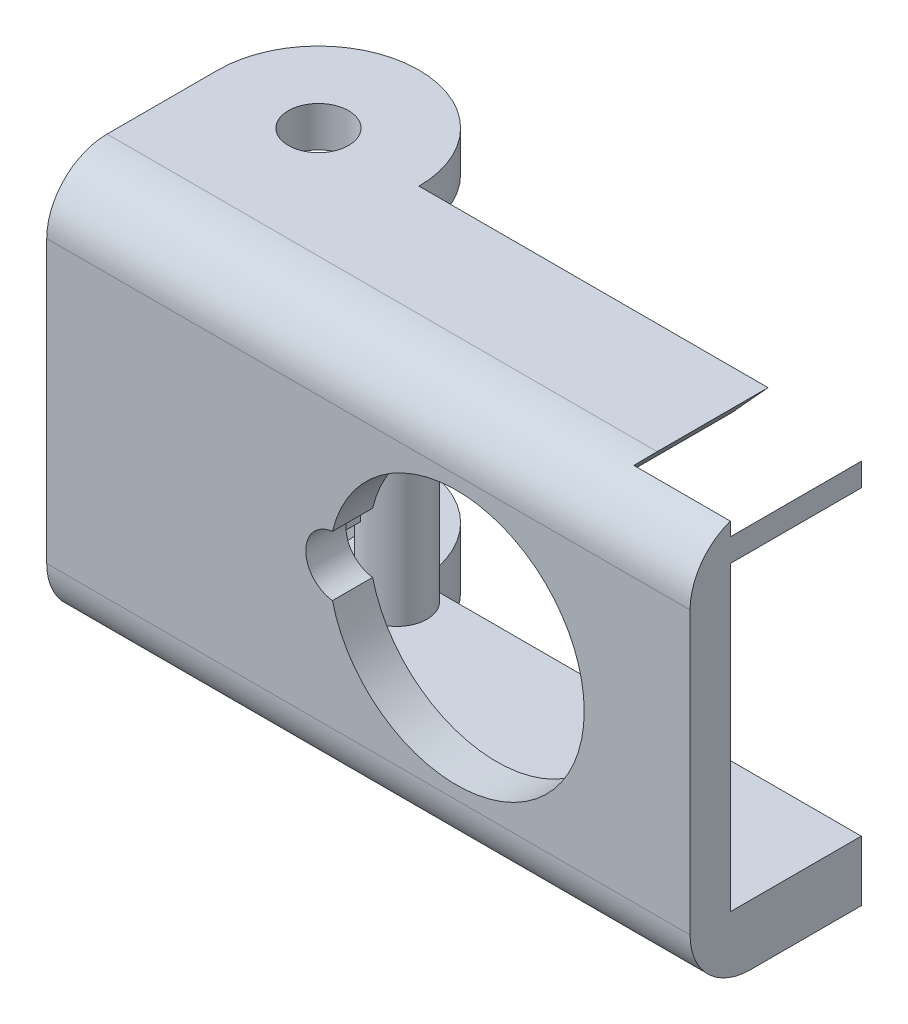
ISO-10303-21;
HEADER;
FILE_DESCRIPTION(('STEP AP214'),'2;1');
FILE_NAME('part.step','',(''),(''),'','','');
FILE_SCHEMA(('AUTOMOTIVE_DESIGN { 1 0 10303 214 1 1 1 1 }'));
ENDSEC;
DATA;
#1=APPLICATION_CONTEXT('core data for automotive mechanical design processes');
#2=APPLICATION_PROTOCOL_DEFINITION('international standard','automotive_design',2000,#1);
#3=PRODUCT_CONTEXT('',#1,'mechanical');
#4=PRODUCT('Part','Part','',(#3));
#5=PRODUCT_RELATED_PRODUCT_CATEGORY('part','',(#4));
#6=PRODUCT_DEFINITION_FORMATION('','',#4);
#7=PRODUCT_DEFINITION_CONTEXT('part definition',#1,'design');
#8=PRODUCT_DEFINITION('design','',#6,#7);
#9=PRODUCT_DEFINITION_SHAPE('','',#8);
#10=(LENGTH_UNIT() NAMED_UNIT(*) SI_UNIT(.MILLI.,.METRE.));
#11=(NAMED_UNIT(*) PLANE_ANGLE_UNIT() SI_UNIT($,.RADIAN.));
#12=(NAMED_UNIT(*) SI_UNIT($,.STERADIAN.) SOLID_ANGLE_UNIT());
#13=UNCERTAINTY_MEASURE_WITH_UNIT(LENGTH_MEASURE(1.E-05),#10,'distance_accuracy_value','');
#14=(GEOMETRIC_REPRESENTATION_CONTEXT(3) GLOBAL_UNCERTAINTY_ASSIGNED_CONTEXT((#13)) GLOBAL_UNIT_ASSIGNED_CONTEXT((#10,
#11,#12)) REPRESENTATION_CONTEXT('',''));
#15=CARTESIAN_POINT('',(0.,0.,0.));
#16=DIRECTION('',(0.,0.,1.));
#17=DIRECTION('',(1.,0.,0.));
#18=AXIS2_PLACEMENT_3D('',#15,#16,#17);
#19=CARTESIAN_POINT('',(5.,-10.,8.51498370755402));
#20=DIRECTION('',(1.,0.,0.));
#21=DIRECTION('',(0.,0.,-1.));
#22=AXIS2_PLACEMENT_3D('',#19,#20,#21);
#23=PLANE('',#22);
#24=DIRECTION('',(0.,0.,1.));
#25=VECTOR('',#24,1.);
#26=CARTESIAN_POINT('',(5.,-3.,-5.));
#27=LINE('',#26,#25);
#28=CARTESIAN_POINT('',(5.,-3.,2.91309511146452));
#29=VERTEX_POINT('',#28);
#30=CARTESIAN_POINT('',(5.,-3.,4.15922742012918));
#31=VERTEX_POINT('',#30);
#32=EDGE_CURVE('E429',#29,#31,#27,.T.);
#33=ORIENTED_EDGE('',*,*,#32,.F.);
#34=DIRECTION('',(0.,1.,0.));
#35=VECTOR('',#34,1.);
#36=CARTESIAN_POINT('',(5.,-9.00000000000001,2.91309511146452));
#37=LINE('',#36,#35);
#38=CARTESIAN_POINT('',(5.,-1.5,2.91309511146452));
#39=VERTEX_POINT('',#38);
#40=EDGE_CURVE('E572',#29,#39,#37,.T.);
#41=ORIENTED_EDGE('',*,*,#40,.T.);
#42=DIRECTION('',(0.,0.,-1.));
#43=VECTOR('',#42,1.);
#44=CARTESIAN_POINT('',(5.,-1.5,-5.));
#45=LINE('',#44,#43);
#46=CARTESIAN_POINT('',(5.,-1.5,4.15922742012918));
#47=VERTEX_POINT('',#46);
#48=EDGE_CURVE('E463',#47,#39,#45,.T.);
#49=ORIENTED_EDGE('',*,*,#48,.F.);
#50=DIRECTION('',(0.,-1.,0.));
#51=VECTOR('',#50,1.);
#52=CARTESIAN_POINT('',(5.,2.5,4.15922742012918));
#53=LINE('',#52,#51);
#54=CARTESIAN_POINT('',(5.,2.5,4.15922742012918));
#55=VERTEX_POINT('',#54);
#56=EDGE_CURVE('E458',#55,#47,#53,.T.);
#57=ORIENTED_EDGE('',*,*,#56,.F.);
#58=DIRECTION('',(0.,0.,1.));
#59=VECTOR('',#58,1.);
#60=CARTESIAN_POINT('',(5.,2.5,-5.));
#61=LINE('',#60,#59);
#62=CARTESIAN_POINT('',(5.,2.5,2.91309511146452));
#63=VERTEX_POINT('',#62);
#64=EDGE_CURVE('E455',#63,#55,#61,.T.);
#65=ORIENTED_EDGE('',*,*,#64,.F.);
#66=CARTESIAN_POINT('',(5.,4.,2.91309511146452));
#67=VERTEX_POINT('',#66);
#68=EDGE_CURVE('E577',#63,#67,#37,.T.);
#69=ORIENTED_EDGE('',*,*,#68,.T.);
#70=DIRECTION('',(0.,0.,-1.));
#71=VECTOR('',#70,1.);
#72=CARTESIAN_POINT('',(5.,4.,-5.));
#73=LINE('',#72,#71);
#74=CARTESIAN_POINT('',(5.,4.,4.15922742012918));
#75=VERTEX_POINT('',#74);
#76=EDGE_CURVE('E434',#75,#67,#73,.T.);
#77=ORIENTED_EDGE('',*,*,#76,.F.);
#78=DIRECTION('',(0.,-1.,0.));
#79=VECTOR('',#78,1.);
#80=CARTESIAN_POINT('',(5.,8.,4.15922742012919));
#81=LINE('',#80,#79);
#82=CARTESIAN_POINT('',(5.,8.,4.15922742012919));
#83=VERTEX_POINT('',#82);
#84=EDGE_CURVE('E430',#83,#75,#81,.T.);
#85=ORIENTED_EDGE('',*,*,#84,.F.);
#86=DIRECTION('',(0.,0.,-1.));
#87=VECTOR('',#86,1.);
#88=CARTESIAN_POINT('',(5.,8.,4.15922742012919));
#89=LINE('',#88,#87);
#90=CARTESIAN_POINT('',(5.,7.99999999999999,6.51498370755402));
#91=VERTEX_POINT('',#90);
#92=EDGE_CURVE('E409',#91,#83,#89,.T.);
#93=ORIENTED_EDGE('',*,*,#92,.F.);
#94=DIRECTION('',(0.,1.,0.));
#95=VECTOR('',#94,1.);
#96=CARTESIAN_POINT('',(5.,8.,6.51498370755402));
#97=LINE('',#96,#95);
#98=CARTESIAN_POINT('',(5.,-7.,6.51498370755401));
#99=VERTEX_POINT('',#98);
#100=EDGE_CURVE('E656',#99,#91,#97,.T.);
#101=ORIENTED_EDGE('',*,*,#100,.F.);
#102=DIRECTION('',(0.,0.,1.));
#103=VECTOR('',#102,1.);
#104=CARTESIAN_POINT('',(5.,-7.,6.51498370755401));
#105=LINE('',#104,#103);
#106=CARTESIAN_POINT('',(5.,-7.,4.15922742012918));
#107=VERTEX_POINT('',#106);
#108=EDGE_CURVE('E628',#107,#99,#105,.T.);
#109=ORIENTED_EDGE('',*,*,#108,.F.);
#110=DIRECTION('',(0.,-1.,0.));
#111=VECTOR('',#110,1.);
#112=CARTESIAN_POINT('',(5.,-3.,4.15922742012918));
#113=LINE('',#112,#111);
#114=EDGE_CURVE('E486',#31,#107,#113,.T.);
#115=ORIENTED_EDGE('',*,*,#114,.F.);
#116=EDGE_LOOP('',(#33,#41,#49,#57,#65,#69,#77,#85,#93,#101,#109,#115));
#117=FACE_BOUND('',#116,.T.);
#118=ADVANCED_FACE('F43',(#117),#23,.T.);
#119=CARTESIAN_POINT('',(27.,-10.,0.));
#120=DIRECTION('',(0.,0.,1.));
#121=DIRECTION('',(0.,-1.,0.));
#122=AXIS2_PLACEMENT_3D('',#119,#120,#121);
#123=PLANE('',#122);
#124=DIRECTION('',(0.,1.,0.));
#125=VECTOR('',#124,1.);
#126=CARTESIAN_POINT('',(5.71685205695563,-9.00000000000001,0.));
#127=LINE('',#126,#125);
#128=CARTESIAN_POINT('',(5.71685205695562,-7.,0.));
#129=VERTEX_POINT('',#128);
#130=CARTESIAN_POINT('',(5.71685205695563,-9.00000000000001,0.));
#131=VERTEX_POINT('',#130);
#132=EDGE_CURVE('E11',#129,#131,#127,.F.);
#133=ORIENTED_EDGE('',*,*,#132,.F.);
#134=DIRECTION('',(-1.,0.,0.));
#135=VECTOR('',#134,1.);
#136=CARTESIAN_POINT('',(27.,-7.,0.));
#137=LINE('',#136,#135);
#138=CARTESIAN_POINT('',(27.,-7.,0.));
#139=VERTEX_POINT('',#138);
#140=EDGE_CURVE('E423',#139,#129,#137,.T.);
#141=ORIENTED_EDGE('',*,*,#140,.F.);
#142=DIRECTION('',(0.,1.,0.));
#143=VECTOR('',#142,1.);
#144=CARTESIAN_POINT('',(27.,-10.,0.));
#145=LINE('',#144,#143);
#146=CARTESIAN_POINT('',(27.,-10.,0.));
#147=VERTEX_POINT('',#146);
#148=EDGE_CURVE('E643',#147,#139,#145,.T.);
#149=ORIENTED_EDGE('',*,*,#148,.F.);
#150=DIRECTION('',(-1.,0.,0.));
#151=VECTOR('',#150,1.);
#152=CARTESIAN_POINT('',(27.,-10.,0.));
#153=LINE('',#152,#151);
#154=CARTESIAN_POINT('',(5.,-10.,0.));
#155=VERTEX_POINT('',#154);
#156=EDGE_CURVE('E286',#147,#155,#153,.T.);
#157=ORIENTED_EDGE('',*,*,#156,.T.);
#158=DIRECTION('',(0.,1.,0.));
#159=VECTOR('',#158,1.);
#160=CARTESIAN_POINT('',(5.,-10.,0.));
#161=LINE('',#160,#159);
#162=CARTESIAN_POINT('',(5.,-9.00000000000001,0.));
#163=VERTEX_POINT('',#162);
#164=EDGE_CURVE('E274',#155,#163,#161,.T.);
#165=ORIENTED_EDGE('',*,*,#164,.T.);
#166=DIRECTION('',(1.,0.,0.));
#167=VECTOR('',#166,1.);
#168=CARTESIAN_POINT('',(27.,-9.00000000000001,0.));
#169=LINE('',#168,#167);
#170=EDGE_CURVE('E52',#163,#131,#169,.T.);
#171=ORIENTED_EDGE('',*,*,#170,.T.);
#172=EDGE_LOOP('',(#133,#141,#149,#157,#165,#171));
#173=FACE_BOUND('',#172,.T.);
#174=ADVANCED_FACE('F283',(#173),#123,.F.);
#175=CARTESIAN_POINT('',(0.,10.,0.));
#176=DIRECTION('',(0.,1.,0.));
#177=DIRECTION('',(0.,0.,1.));
#178=AXIS2_PLACEMENT_3D('',#175,#176,#177);
#179=PLANE('',#178);
#180=CARTESIAN_POINT('',(0.,10.,0.));
#181=DIRECTION('',(0.,1.,0.));
#182=DIRECTION('',(0.,0.,1.));
#183=AXIS2_PLACEMENT_3D('',#180,#181,#182);
#184=CIRCLE('',#183,1.5);
#185=CARTESIAN_POINT('',(0.,10.,1.5));
#186=VERTEX_POINT('',#185);
#187=EDGE_CURVE('E522',#186,#186,#184,.T.);
#188=ORIENTED_EDGE('',*,*,#187,.F.);
#189=EDGE_LOOP('',(#188));
#190=FACE_BOUND('',#189,.T.);
#191=DIRECTION('',(1.,0.,0.));
#192=VECTOR('',#191,1.);
#193=CARTESIAN_POINT('',(0.,10.,5.51498370755402));
#194=LINE('',#193,#192);
#195=CARTESIAN_POINT('',(-5.,10.,5.51498370755402));
#196=VERTEX_POINT('',#195);
#197=CARTESIAN_POINT('',(22.3626326723976,10.,5.51498370755402));
#198=VERTEX_POINT('',#197);
#199=EDGE_CURVE('E363',#196,#198,#194,.T.);
#200=ORIENTED_EDGE('',*,*,#199,.T.);
#201=DIRECTION('',(0.,0.,-1.));
#202=VECTOR('',#201,1.);
#203=CARTESIAN_POINT('',(22.3626326723976,10.,0.));
#204=LINE('',#203,#202);
#205=CARTESIAN_POINT('',(22.3626326723976,10.,0.));
#206=VERTEX_POINT('',#205);
#207=EDGE_CURVE('E380',#198,#206,#204,.T.);
#208=ORIENTED_EDGE('',*,*,#207,.T.);
#209=DIRECTION('',(-1.,0.,0.));
#210=VECTOR('',#209,1.);
#211=CARTESIAN_POINT('',(27.,10.,0.));
#212=LINE('',#211,#210);
#213=CARTESIAN_POINT('',(5.,10.,0.));
#214=VERTEX_POINT('',#213);
#215=EDGE_CURVE('E389',#206,#214,#212,.T.);
#216=ORIENTED_EDGE('',*,*,#215,.T.);
#217=CARTESIAN_POINT('',(0.,10.,0.));
#218=DIRECTION('',(0.,1.,0.));
#219=DIRECTION('',(0.,0.,1.));
#220=AXIS2_PLACEMENT_3D('',#217,#218,#219);
#221=CIRCLE('',#220,5.);
#222=CARTESIAN_POINT('',(-5.,10.,0.));
#223=VERTEX_POINT('',#222);
#224=EDGE_CURVE('E526',#214,#223,#221,.T.);
#225=ORIENTED_EDGE('',*,*,#224,.T.);
#226=DIRECTION('',(0.,0.,1.));
#227=VECTOR('',#226,1.);
#228=CARTESIAN_POINT('',(-5.,10.,0.));
#229=LINE('',#228,#227);
#230=EDGE_CURVE('E529',#223,#196,#229,.T.);
#231=ORIENTED_EDGE('',*,*,#230,.T.);
#232=EDGE_LOOP('',(#200,#208,#216,#225,#231));
#233=FACE_BOUND('',#232,.T.);
#234=ADVANCED_FACE('F387',(#190,#233),#179,.T.);
#235=CARTESIAN_POINT('',(-5.,8.,-5.));
#236=DIRECTION('',(0.,1.,0.));
#237=DIRECTION('',(0.,0.,1.));
#238=AXIS2_PLACEMENT_3D('',#235,#236,#237);
#239=PLANE('',#238);
#240=CARTESIAN_POINT('',(5.35842602847782,8.,1.45654755573227));
#241=DIRECTION('',(0.,-1.,0.));
#242=DIRECTION('',(0.,0.,-1.));
#243=AXIS2_PLACEMENT_3D('',#240,#241,#242);
#244=CIRCLE('',#243,1.5);
#245=CARTESIAN_POINT('',(5.7168520569556,8.,0.));
#246=VERTEX_POINT('',#245);
#247=CARTESIAN_POINT('',(5.,8.,0.));
#248=VERTEX_POINT('',#247);
#249=EDGE_CURVE('E268',#246,#248,#244,.T.);
#250=ORIENTED_EDGE('',*,*,#249,.F.);
#251=DIRECTION('',(-1.,0.,0.));
#252=VECTOR('',#251,1.);
#253=CARTESIAN_POINT('',(27.,8.,0.));
#254=LINE('',#253,#252);
#255=CARTESIAN_POINT('',(20.5394901514433,8.,0.));
#256=VERTEX_POINT('',#255);
#257=EDGE_CURVE('E398',#256,#246,#254,.T.);
#258=ORIENTED_EDGE('',*,*,#257,.F.);
#259=DIRECTION('',(0.,0.,-1.));
#260=VECTOR('',#259,1.);
#261=CARTESIAN_POINT('',(20.5394901514433,8.,-4.99999999999999));
#262=LINE('',#261,#260);
#263=CARTESIAN_POINT('',(20.5394901514433,8.,6.51498370755402));
#264=VERTEX_POINT('',#263);
#265=EDGE_CURVE('E383',#264,#256,#262,.T.);
#266=ORIENTED_EDGE('',*,*,#265,.F.);
#267=DIRECTION('',(-1.,0.,0.));
#268=VECTOR('',#267,1.);
#269=CARTESIAN_POINT('',(27.,8.,6.51498370755402));
#270=LINE('',#269,#268);
#271=EDGE_CURVE('E414',#264,#91,#270,.T.);
#272=ORIENTED_EDGE('',*,*,#271,.T.);
#273=ORIENTED_EDGE('',*,*,#92,.T.);
#274=DIRECTION('',(1.,0.,0.));
#275=VECTOR('',#274,1.);
#276=CARTESIAN_POINT('',(-5.,8.,4.15922742012919));
#277=LINE('',#276,#275);
#278=CARTESIAN_POINT('',(-5.,8.,4.15922742012919));
#279=VERTEX_POINT('',#278);
#280=EDGE_CURVE('E450',#279,#83,#277,.T.);
#281=ORIENTED_EDGE('',*,*,#280,.F.);
#282=DIRECTION('',(0.,0.,1.));
#283=VECTOR('',#282,1.);
#284=CARTESIAN_POINT('',(-5.,8.,-5.));
#285=LINE('',#284,#283);
#286=CARTESIAN_POINT('',(-5.,8.,0.));
#287=VERTEX_POINT('',#286);
#288=EDGE_CURVE('E438',#287,#279,#285,.T.);
#289=ORIENTED_EDGE('',*,*,#288,.F.);
#290=CARTESIAN_POINT('',(0.,8.,0.));
#291=DIRECTION('',(0.,1.,0.));
#292=DIRECTION('',(0.,0.,1.));
#293=AXIS2_PLACEMENT_3D('',#290,#291,#292);
#294=CIRCLE('',#293,5.);
#295=EDGE_CURVE('E346',#287,#248,#294,.F.);
#296=ORIENTED_EDGE('',*,*,#295,.T.);
#297=EDGE_LOOP('',(#250,#258,#266,#272,#273,#281,#289,#296));
#298=FACE_BOUND('',#297,.T.);
#299=CARTESIAN_POINT('',(0.,8.,0.));
#300=DIRECTION('',(0.,1.,0.));
#301=DIRECTION('',(0.,0.,1.));
#302=AXIS2_PLACEMENT_3D('',#299,#300,#301);
#303=CIRCLE('',#302,1.5);
#304=CARTESIAN_POINT('',(0.,8.,1.5));
#305=VERTEX_POINT('',#304);
#306=EDGE_CURVE('E342',#305,#305,#303,.F.);
#307=ORIENTED_EDGE('',*,*,#306,.F.);
#308=EDGE_LOOP('',(#307));
#309=FACE_BOUND('',#308,.T.);
#310=ADVANCED_FACE('F667',(#298,#309),#239,.F.);
#311=DIRECTION('',(0.,0.,1.));
#312=VECTOR('',#311,1.);
#313=CARTESIAN_POINT('',(25.9520121705067,8.,-4.99999999999999));
#314=LINE('',#313,#312);
#315=CARTESIAN_POINT('',(25.9520121705067,8.,0.));
#316=VERTEX_POINT('',#315);
#317=CARTESIAN_POINT('',(25.9520121705067,8.,6.51498370755402));
#318=VERTEX_POINT('',#317);
#319=EDGE_CURVE('E600',#316,#318,#314,.T.);
#320=ORIENTED_EDGE('',*,*,#319,.F.);
#321=CARTESIAN_POINT('',(27.,8.,0.));
#322=VERTEX_POINT('',#321);
#323=EDGE_CURVE('E403',#322,#316,#254,.T.);
#324=ORIENTED_EDGE('',*,*,#323,.F.);
#325=DIRECTION('',(0.,0.,-1.));
#326=VECTOR('',#325,1.);
#327=CARTESIAN_POINT('',(27.,8.,4.15922742012919));
#328=LINE('',#327,#326);
#329=CARTESIAN_POINT('',(27.,8.,6.51498370755402));
#330=VERTEX_POINT('',#329);
#331=EDGE_CURVE('E406',#330,#322,#328,.T.);
#332=ORIENTED_EDGE('',*,*,#331,.F.);
#333=EDGE_CURVE('E415',#330,#318,#270,.T.);
#334=ORIENTED_EDGE('',*,*,#333,.T.);
#335=EDGE_LOOP('',(#320,#324,#332,#334));
#336=FACE_BOUND('',#335,.T.);
#337=ADVANCED_FACE('F709',(#336),#239,.F.);
#338=CARTESIAN_POINT('',(0.,7.,5.51498370755402));
#339=DIRECTION('',(1.,0.,0.));
#340=DIRECTION('',(0.,0.,-1.));
#341=AXIS2_PLACEMENT_3D('',#338,#339,#340);
#342=CYLINDRICAL_SURFACE('',#341,3.);
#343=DIRECTION('',(1.,0.,0.));
#344=VECTOR('',#343,1.);
#345=CARTESIAN_POINT('',(0.,9.82842712474619,6.51498370755402));
#346=LINE('',#345,#344);
#347=CARTESIAN_POINT('',(27.,9.82842712474619,6.51498370755402));
#348=VERTEX_POINT('',#347);
#349=CARTESIAN_POINT('',(22.2062317702388,9.82842712474619,6.51498370755402));
#350=VERTEX_POINT('',#349);
#351=EDGE_CURVE('E593',#348,#350,#346,.F.);
#352=ORIENTED_EDGE('',*,*,#351,.T.);
#353=CARTESIAN_POINT('',(19.6279188909661,7.,5.51498370755402));
#354=DIRECTION('',(0.739027016594407,-0.673675789043639,0.));
#355=DIRECTION('',(0.673675789043639,0.739027016594407,0.));
#356=AXIS2_PLACEMENT_3D('',#353,#354,#355);
#357=ELLIPSE('',#356,4.05939151429759,3.);
#358=EDGE_CURVE('E394',#350,#198,#357,.F.);
#359=ORIENTED_EDGE('',*,*,#358,.T.);
#360=ORIENTED_EDGE('',*,*,#199,.F.);
#361=CARTESIAN_POINT('',(-5.,7.,5.51498370755402));
#362=DIRECTION('',(-1.,0.,0.));
#363=DIRECTION('',(0.,0.,1.));
#364=AXIS2_PLACEMENT_3D('',#361,#362,#363);
#365=CIRCLE('',#364,3.);
#366=CARTESIAN_POINT('',(-5.,7.,8.51498370755402));
#367=VERTEX_POINT('',#366);
#368=EDGE_CURVE('E357',#367,#196,#365,.T.);
#369=ORIENTED_EDGE('',*,*,#368,.F.);
#370=DIRECTION('',(1.,0.,0.));
#371=VECTOR('',#370,1.);
#372=CARTESIAN_POINT('',(-5.,7.,8.51498370755402));
#373=LINE('',#372,#371);
#374=CARTESIAN_POINT('',(27.,7.,8.51498370755402));
#375=VERTEX_POINT('',#374);
#376=EDGE_CURVE('E288',#375,#367,#373,.F.);
#377=ORIENTED_EDGE('',*,*,#376,.F.);
#378=CARTESIAN_POINT('',(27.,7.,5.51498370755402));
#379=DIRECTION('',(1.,0.,0.));
#380=DIRECTION('',(0.,0.,-1.));
#381=AXIS2_PLACEMENT_3D('',#378,#379,#380);
#382=CIRCLE('',#381,3.);
#383=EDGE_CURVE('E629',#348,#375,#382,.T.);
#384=ORIENTED_EDGE('',*,*,#383,.F.);
#385=EDGE_LOOP('',(#352,#359,#360,#369,#377,#384));
#386=FACE_BOUND('',#385,.T.);
#387=ADVANCED_FACE('F45',(#386),#342,.T.);
#388=CARTESIAN_POINT('',(27.,8.,0.));
#389=DIRECTION('',(0.,0.,1.));
#390=DIRECTION('',(0.,-1.,0.));
#391=AXIS2_PLACEMENT_3D('',#388,#389,#390);
#392=PLANE('',#391);
#393=DIRECTION('',(0.673675789043639,0.739027016594407,0.));
#394=VECTOR('',#393,1.);
#395=CARTESIAN_POINT('',(23.4715219247209,11.2164592066482,0.));
#396=LINE('',#395,#394);
#397=EDGE_CURVE('E259',#256,#206,#396,.T.);
#398=ORIENTED_EDGE('',*,*,#397,.F.);
#399=ORIENTED_EDGE('',*,*,#257,.T.);
#400=DIRECTION('',(1.,0.,0.));
#401=VECTOR('',#400,1.);
#402=CARTESIAN_POINT('',(27.,8.,0.));
#403=LINE('',#402,#401);
#404=EDGE_CURVE('E582',#248,#246,#403,.T.);
#405=ORIENTED_EDGE('',*,*,#404,.F.);
#406=EDGE_CURVE('E281',#248,#214,#161,.T.);
#407=ORIENTED_EDGE('',*,*,#406,.T.);
#408=ORIENTED_EDGE('',*,*,#215,.F.);
#409=EDGE_LOOP('',(#398,#399,#405,#407,#408));
#410=FACE_BOUND('',#409,.T.);
#411=ADVANCED_FACE('F396',(#410),#392,.F.);
#412=DIRECTION('',(-0.67367578904364,-0.739027016594407,0.));
#413=VECTOR('',#412,1.);
#414=CARTESIAN_POINT('',(26.4276299910986,8.52175605047361,0.));
#415=LINE('',#414,#413);
#416=CARTESIAN_POINT('',(27.,9.14964992308412,0.));
#417=VERTEX_POINT('',#416);
#418=EDGE_CURVE('E597',#417,#316,#415,.T.);
#419=ORIENTED_EDGE('',*,*,#418,.F.);
#420=DIRECTION('',(0.,1.,0.));
#421=VECTOR('',#420,1.);
#422=CARTESIAN_POINT('',(27.,8.,0.));
#423=LINE('',#422,#421);
#424=EDGE_CURVE('E399',#322,#417,#423,.T.);
#425=ORIENTED_EDGE('',*,*,#424,.F.);
#426=ORIENTED_EDGE('',*,*,#323,.T.);
#427=EDGE_LOOP('',(#419,#425,#426));
#428=FACE_BOUND('',#427,.T.);
#429=ADVANCED_FACE('F712',(#428),#392,.F.);
#430=CARTESIAN_POINT('',(27.,7.,5.51498370755402));
#431=DIRECTION('',(1.,0.,0.));
#432=DIRECTION('',(0.,0.,-1.));
#433=AXIS2_PLACEMENT_3D('',#430,#431,#432);
#434=PLANE('',#433);
#435=ORIENTED_EDGE('',*,*,#424,.T.);
#436=DIRECTION('',(0.,0.,1.));
#437=VECTOR('',#436,1.);
#438=CARTESIAN_POINT('',(27.,9.14964992308412,5.51498370755402));
#439=LINE('',#438,#437);
#440=CARTESIAN_POINT('',(27.,9.14964992308412,6.51498370755402));
#441=VERTEX_POINT('',#440);
#442=EDGE_CURVE('E371',#417,#441,#439,.T.);
#443=ORIENTED_EDGE('',*,*,#442,.T.);
#444=DIRECTION('',(0.,1.,0.));
#445=VECTOR('',#444,1.);
#446=CARTESIAN_POINT('',(27.,7.,6.51498370755402));
#447=LINE('',#446,#445);
#448=EDGE_CURVE('E367',#441,#348,#447,.T.);
#449=ORIENTED_EDGE('',*,*,#448,.T.);
#450=ORIENTED_EDGE('',*,*,#383,.T.);
#451=DIRECTION('',(0.,-1.,0.));
#452=VECTOR('',#451,1.);
#453=CARTESIAN_POINT('',(27.,7.,8.51498370755402));
#454=LINE('',#453,#452);
#455=CARTESIAN_POINT('',(27.,-7.,8.51498370755402));
#456=VERTEX_POINT('',#455);
#457=EDGE_CURVE('E632',#375,#456,#454,.T.);
#458=ORIENTED_EDGE('',*,*,#457,.T.);
#459=CARTESIAN_POINT('',(27.,-7.,5.51498370755402));
#460=DIRECTION('',(1.,0.,0.));
#461=DIRECTION('',(0.,0.,-1.));
#462=AXIS2_PLACEMENT_3D('',#459,#460,#461);
#463=CIRCLE('',#462,3.);
#464=CARTESIAN_POINT('',(27.,-10.,5.51498370755402));
#465=VERTEX_POINT('',#464);
#466=EDGE_CURVE('E636',#456,#465,#463,.T.);
#467=ORIENTED_EDGE('',*,*,#466,.T.);
#468=DIRECTION('',(0.,0.,-1.));
#469=VECTOR('',#468,1.);
#470=CARTESIAN_POINT('',(27.,-10.,5.51498370755402));
#471=LINE('',#470,#469);
#472=EDGE_CURVE('E640',#465,#147,#471,.T.);
#473=ORIENTED_EDGE('',*,*,#472,.T.);
#474=ORIENTED_EDGE('',*,*,#148,.T.);
#475=DIRECTION('',(0.,0.,1.));
#476=VECTOR('',#475,1.);
#477=CARTESIAN_POINT('',(27.,-7.,0.));
#478=LINE('',#477,#476);
#479=CARTESIAN_POINT('',(27.,-7.,6.51498370755401));
#480=VERTEX_POINT('',#479);
#481=EDGE_CURVE('E646',#139,#480,#478,.T.);
#482=ORIENTED_EDGE('',*,*,#481,.T.);
#483=DIRECTION('',(0.,1.,0.));
#484=VECTOR('',#483,1.);
#485=CARTESIAN_POINT('',(27.,8.,6.51498370755402));
#486=LINE('',#485,#484);
#487=EDGE_CURVE('E649',#480,#330,#486,.T.);
#488=ORIENTED_EDGE('',*,*,#487,.T.);
#489=ORIENTED_EDGE('',*,*,#331,.T.);
#490=EDGE_LOOP('',(#435,#443,#449,#450,#458,#467,#473,#474,#482,#488,#489));
#491=FACE_BOUND('',#490,.T.);
#492=ADVANCED_FACE('F685',(#491),#434,.T.);
#493=CARTESIAN_POINT('',(0.,-10.,0.));
#494=DIRECTION('',(0.,1.,0.));
#495=DIRECTION('',(0.,0.,1.));
#496=AXIS2_PLACEMENT_3D('',#493,#494,#495);
#497=CYLINDRICAL_SURFACE('',#496,5.);
#498=CARTESIAN_POINT('',(0.,4.,0.));
#499=DIRECTION('',(0.,-1.,0.));
#500=DIRECTION('',(0.,0.,-1.));
#501=AXIS2_PLACEMENT_3D('',#498,#499,#500);
#502=CIRCLE('',#501,5.);
#503=CARTESIAN_POINT('',(5.,4.,0.));
#504=VERTEX_POINT('',#503);
#505=CARTESIAN_POINT('',(-5.,4.,0.));
#506=VERTEX_POINT('',#505);
#507=EDGE_CURVE('E350',#504,#506,#502,.F.);
#508=ORIENTED_EDGE('',*,*,#507,.F.);
#509=CARTESIAN_POINT('',(5.,2.5,0.));
#510=VERTEX_POINT('',#509);
#511=EDGE_CURVE('E296',#510,#504,#161,.T.);
#512=ORIENTED_EDGE('',*,*,#511,.F.);
#513=CARTESIAN_POINT('',(0.,2.5,0.));
#514=DIRECTION('',(0.,1.,0.));
#515=DIRECTION('',(0.,0.,1.));
#516=AXIS2_PLACEMENT_3D('',#513,#514,#515);
#517=CIRCLE('',#516,5.);
#518=CARTESIAN_POINT('',(-5.,2.5,0.));
#519=VERTEX_POINT('',#518);
#520=EDGE_CURVE('E336',#519,#510,#517,.F.);
#521=ORIENTED_EDGE('',*,*,#520,.F.);
#522=DIRECTION('',(0.,1.,0.));
#523=VECTOR('',#522,1.);
#524=CARTESIAN_POINT('',(-5.,-10.,0.));
#525=LINE('',#524,#523);
#526=EDGE_CURVE('E544',#519,#506,#525,.T.);
#527=ORIENTED_EDGE('',*,*,#526,.T.);
#528=EDGE_LOOP('',(#508,#512,#521,#527));
#529=FACE_BOUND('',#528,.T.);
#530=ADVANCED_FACE('F745',(#529),#497,.T.);
#531=CARTESIAN_POINT('',(0.,-1.5,0.));
#532=DIRECTION('',(0.,-1.,0.));
#533=DIRECTION('',(0.,0.,-1.));
#534=AXIS2_PLACEMENT_3D('',#531,#532,#533);
#535=CIRCLE('',#534,5.);
#536=CARTESIAN_POINT('',(5.,-1.5,0.));
#537=VERTEX_POINT('',#536);
#538=CARTESIAN_POINT('',(-5.,-1.5,0.));
#539=VERTEX_POINT('',#538);
#540=EDGE_CURVE('E341',#537,#539,#535,.F.);
#541=ORIENTED_EDGE('',*,*,#540,.F.);
#542=CARTESIAN_POINT('',(5.,-3.,0.));
#543=VERTEX_POINT('',#542);
#544=EDGE_CURVE('E279',#543,#537,#161,.T.);
#545=ORIENTED_EDGE('',*,*,#544,.F.);
#546=CARTESIAN_POINT('',(0.,-3.,0.));
#547=DIRECTION('',(0.,1.,0.));
#548=DIRECTION('',(0.,0.,1.));
#549=AXIS2_PLACEMENT_3D('',#546,#547,#548);
#550=CIRCLE('',#549,5.);
#551=CARTESIAN_POINT('',(-5.,-3.,0.));
#552=VERTEX_POINT('',#551);
#553=EDGE_CURVE('E326',#552,#543,#550,.F.);
#554=ORIENTED_EDGE('',*,*,#553,.F.);
#555=EDGE_CURVE('E318',#552,#539,#525,.T.);
#556=ORIENTED_EDGE('',*,*,#555,.T.);
#557=EDGE_LOOP('',(#541,#545,#554,#556));
#558=FACE_BOUND('',#557,.T.);
#559=ADVANCED_FACE('F561',(#558),#497,.T.);
#560=CARTESIAN_POINT('',(0.,-7.,0.));
#561=DIRECTION('',(0.,-1.,0.));
#562=DIRECTION('',(0.,0.,-1.));
#563=AXIS2_PLACEMENT_3D('',#560,#561,#562);
#564=CIRCLE('',#563,5.);
#565=CARTESIAN_POINT('',(5.,-7.,0.));
#566=VERTEX_POINT('',#565);
#567=CARTESIAN_POINT('',(-5.,-7.,0.));
#568=VERTEX_POINT('',#567);
#569=EDGE_CURVE('E277',#566,#568,#564,.F.);
#570=ORIENTED_EDGE('',*,*,#569,.F.);
#571=EDGE_CURVE('E264',#163,#566,#161,.T.);
#572=ORIENTED_EDGE('',*,*,#571,.F.);
#573=ORIENTED_EDGE('',*,*,#164,.F.);
#574=CARTESIAN_POINT('',(0.,-10.,0.));
#575=DIRECTION('',(0.,1.,0.));
#576=DIRECTION('',(0.,0.,1.));
#577=AXIS2_PLACEMENT_3D('',#574,#575,#576);
#578=CIRCLE('',#577,5.);
#579=CARTESIAN_POINT('',(-5.,-10.,0.));
#580=VERTEX_POINT('',#579);
#581=EDGE_CURVE('E536',#155,#580,#578,.T.);
#582=ORIENTED_EDGE('',*,*,#581,.T.);
#583=EDGE_CURVE('E313',#580,#568,#525,.T.);
#584=ORIENTED_EDGE('',*,*,#583,.T.);
#585=EDGE_LOOP('',(#570,#572,#573,#582,#584));
#586=FACE_BOUND('',#585,.T.);
#587=ADVANCED_FACE('F272',(#586),#497,.T.);
#588=CARTESIAN_POINT('',(0.,-10.,0.));
#589=DIRECTION('',(0.,1.,0.));
#590=DIRECTION('',(0.,0.,1.));
#591=AXIS2_PLACEMENT_3D('',#588,#589,#590);
#592=CYLINDRICAL_SURFACE('',#591,1.5);
#593=CARTESIAN_POINT('',(0.,-7.,0.));
#594=DIRECTION('',(0.,-1.,0.));
#595=DIRECTION('',(0.,0.,-1.));
#596=AXIS2_PLACEMENT_3D('',#593,#594,#595);
#597=CIRCLE('',#596,1.5);
#598=CARTESIAN_POINT('',(0.,-7.,-1.5));
#599=VERTEX_POINT('',#598);
#600=EDGE_CURVE('E328',#599,#599,#597,.F.);
#601=ORIENTED_EDGE('',*,*,#600,.T.);
#602=EDGE_LOOP('',(#601));
#603=FACE_BOUND('',#602,.T.);
#604=CARTESIAN_POINT('',(0.,-10.,0.));
#605=DIRECTION('',(0.,1.,0.));
#606=DIRECTION('',(0.,0.,1.));
#607=AXIS2_PLACEMENT_3D('',#604,#605,#606);
#608=CIRCLE('',#607,1.5);
#609=CARTESIAN_POINT('',(0.,-10.,1.5));
#610=VERTEX_POINT('',#609);
#611=EDGE_CURVE('E532',#610,#610,#608,.T.);
#612=ORIENTED_EDGE('',*,*,#611,.F.);
#613=EDGE_LOOP('',(#612));
#614=FACE_BOUND('',#613,.T.);
#615=ADVANCED_FACE('F744',(#603,#614),#592,.F.);
#616=ORIENTED_EDGE('',*,*,#295,.F.);
#617=EDGE_CURVE('E320',#287,#223,#525,.T.);
#618=ORIENTED_EDGE('',*,*,#617,.T.);
#619=ORIENTED_EDGE('',*,*,#224,.F.);
#620=ORIENTED_EDGE('',*,*,#406,.F.);
#621=EDGE_LOOP('',(#616,#618,#619,#620));
#622=FACE_BOUND('',#621,.T.);
#623=ADVANCED_FACE('F676',(#622),#497,.T.);
#624=CARTESIAN_POINT('',(-5.,-10.,8.51498370755402));
#625=DIRECTION('',(0.,0.,1.));
#626=DIRECTION('',(1.,0.,0.));
#627=AXIS2_PLACEMENT_3D('',#624,#625,#626);
#628=PLANE('',#627);
#629=CARTESIAN_POINT('',(9.38359812104737,0.,8.51498370755402));
#630=DIRECTION('',(0.,0.,1.));
#631=DIRECTION('',(1.,0.,0.));
#632=AXIS2_PLACEMENT_3D('',#629,#630,#631);
#633=CIRCLE('',#632,1.5);
#634=CARTESIAN_POINT('',(9.21088978771404,1.49002410436785,8.51498370755402));
#635=VERTEX_POINT('',#634);
#636=CARTESIAN_POINT('',(9.21088978771404,-1.49002410436785,8.51498370755402));
#637=VERTEX_POINT('',#636);
#638=EDGE_CURVE('E624',#635,#637,#633,.T.);
#639=ORIENTED_EDGE('',*,*,#638,.F.);
#640=CARTESIAN_POINT('',(15.3835981210474,0.,8.51498370755402));
#641=DIRECTION('',(0.,0.,1.));
#642=DIRECTION('',(1.,0.,0.));
#643=AXIS2_PLACEMENT_3D('',#640,#641,#642);
#644=CIRCLE('',#643,6.35);
#645=EDGE_CURVE('E618',#637,#635,#644,.T.);
#646=ORIENTED_EDGE('',*,*,#645,.F.);
#647=EDGE_LOOP('',(#639,#646));
#648=FACE_BOUND('',#647,.T.);
#649=DIRECTION('',(0.,1.,0.));
#650=VECTOR('',#649,1.);
#651=CARTESIAN_POINT('',(-5.,-10.,8.51498370755402));
#652=LINE('',#651,#650);
#653=CARTESIAN_POINT('',(-5.,-7.,8.51498370755402));
#654=VERTEX_POINT('',#653);
#655=EDGE_CURVE('E306',#654,#367,#652,.T.);
#656=ORIENTED_EDGE('',*,*,#655,.F.);
#657=DIRECTION('',(1.,0.,0.));
#658=VECTOR('',#657,1.);
#659=CARTESIAN_POINT('',(5.,-7.,8.51498370755402));
#660=LINE('',#659,#658);
#661=EDGE_CURVE('E290',#654,#456,#660,.T.);
#662=ORIENTED_EDGE('',*,*,#661,.T.);
#663=ORIENTED_EDGE('',*,*,#457,.F.);
#664=ORIENTED_EDGE('',*,*,#376,.T.);
#665=EDGE_LOOP('',(#656,#662,#663,#664));
#666=FACE_BOUND('',#665,.T.);
#667=ADVANCED_FACE('F688',(#648,#666),#628,.T.);
#668=CARTESIAN_POINT('',(-5.,-10.,0.));
#669=DIRECTION('',(-1.,0.,0.));
#670=DIRECTION('',(0.,0.,1.));
#671=AXIS2_PLACEMENT_3D('',#668,#669,#670);
#672=PLANE('',#671);
#673=DIRECTION('',(0.,0.,1.));
#674=VECTOR('',#673,1.);
#675=CARTESIAN_POINT('',(-5.,-10.,0.));
#676=LINE('',#675,#674);
#677=CARTESIAN_POINT('',(-5.,-10.,5.51498370755402));
#678=VERTEX_POINT('',#677);
#679=EDGE_CURVE('E538',#580,#678,#676,.T.);
#680=ORIENTED_EDGE('',*,*,#679,.T.);
#681=CARTESIAN_POINT('',(-5.,-7.,5.51498370755402));
#682=DIRECTION('',(-1.,0.,0.));
#683=DIRECTION('',(0.,0.,1.));
#684=AXIS2_PLACEMENT_3D('',#681,#682,#683);
#685=CIRCLE('',#684,3.);
#686=EDGE_CURVE('E360',#678,#654,#685,.T.);
#687=ORIENTED_EDGE('',*,*,#686,.T.);
#688=ORIENTED_EDGE('',*,*,#655,.T.);
#689=ORIENTED_EDGE('',*,*,#368,.T.);
#690=ORIENTED_EDGE('',*,*,#230,.F.);
#691=ORIENTED_EDGE('',*,*,#617,.F.);
#692=ORIENTED_EDGE('',*,*,#288,.T.);
#693=DIRECTION('',(0.,-1.,0.));
#694=VECTOR('',#693,1.);
#695=CARTESIAN_POINT('',(-5.,8.,4.15922742012919));
#696=LINE('',#695,#694);
#697=CARTESIAN_POINT('',(-5.,4.,4.15922742012918));
#698=VERTEX_POINT('',#697);
#699=EDGE_CURVE('E442',#279,#698,#696,.T.);
#700=ORIENTED_EDGE('',*,*,#699,.T.);
#701=DIRECTION('',(0.,0.,-1.));
#702=VECTOR('',#701,1.);
#703=CARTESIAN_POINT('',(-5.,4.,-5.));
#704=LINE('',#703,#702);
#705=EDGE_CURVE('E446',#698,#506,#704,.T.);
#706=ORIENTED_EDGE('',*,*,#705,.T.);
#707=ORIENTED_EDGE('',*,*,#526,.F.);
#708=DIRECTION('',(0.,0.,1.));
#709=VECTOR('',#708,1.);
#710=CARTESIAN_POINT('',(-5.,2.5,-5.));
#711=LINE('',#710,#709);
#712=CARTESIAN_POINT('',(-5.,2.5,4.15922742012918));
#713=VERTEX_POINT('',#712);
#714=EDGE_CURVE('E466',#519,#713,#711,.T.);
#715=ORIENTED_EDGE('',*,*,#714,.T.);
#716=DIRECTION('',(0.,-1.,0.));
#717=VECTOR('',#716,1.);
#718=CARTESIAN_POINT('',(-5.,2.5,4.15922742012918));
#719=LINE('',#718,#717);
#720=CARTESIAN_POINT('',(-5.,-1.5,4.15922742012918));
#721=VERTEX_POINT('',#720);
#722=EDGE_CURVE('E470',#713,#721,#719,.T.);
#723=ORIENTED_EDGE('',*,*,#722,.T.);
#724=DIRECTION('',(0.,0.,-1.));
#725=VECTOR('',#724,1.);
#726=CARTESIAN_POINT('',(-5.,-1.5,-5.));
#727=LINE('',#726,#725);
#728=EDGE_CURVE('E474',#721,#539,#727,.T.);
#729=ORIENTED_EDGE('',*,*,#728,.T.);
#730=ORIENTED_EDGE('',*,*,#555,.F.);
#731=DIRECTION('',(0.,0.,1.));
#732=VECTOR('',#731,1.);
#733=CARTESIAN_POINT('',(-5.,-3.,-5.));
#734=LINE('',#733,#732);
#735=CARTESIAN_POINT('',(-5.,-3.,4.15922742012918));
#736=VERTEX_POINT('',#735);
#737=EDGE_CURVE('E490',#552,#736,#734,.T.);
#738=ORIENTED_EDGE('',*,*,#737,.T.);
#739=DIRECTION('',(0.,-1.,0.));
#740=VECTOR('',#739,1.);
#741=CARTESIAN_POINT('',(-5.,-3.,4.15922742012918));
#742=LINE('',#741,#740);
#743=CARTESIAN_POINT('',(-5.,-7.,4.15922742012918));
#744=VERTEX_POINT('',#743);
#745=EDGE_CURVE('E494',#736,#744,#742,.T.);
#746=ORIENTED_EDGE('',*,*,#745,.T.);
#747=DIRECTION('',(0.,0.,-1.));
#748=VECTOR('',#747,1.);
#749=CARTESIAN_POINT('',(-5.,-7.,-5.));
#750=LINE('',#749,#748);
#751=EDGE_CURVE('E498',#744,#568,#750,.T.);
#752=ORIENTED_EDGE('',*,*,#751,.T.);
#753=ORIENTED_EDGE('',*,*,#583,.F.);
#754=EDGE_LOOP('',(#680,#687,#688,#689,#690,#691,#692,#700,#706,#707,#715,#723,#729,#730,#738,
#746,#752,#753));
#755=FACE_BOUND('',#754,.T.);
#756=ADVANCED_FACE('F562',(#755),#672,.T.);
#757=CARTESIAN_POINT('',(0.,-10.,0.));
#758=DIRECTION('',(0.,1.,0.));
#759=DIRECTION('',(0.,0.,1.));
#760=AXIS2_PLACEMENT_3D('',#757,#758,#759);
#761=PLANE('',#760);
#762=ORIENTED_EDGE('',*,*,#611,.T.);
#763=EDGE_LOOP('',(#762));
#764=FACE_BOUND('',#763,.T.);
#765=ORIENTED_EDGE('',*,*,#581,.F.);
#766=ORIENTED_EDGE('',*,*,#156,.F.);
#767=ORIENTED_EDGE('',*,*,#472,.F.);
#768=DIRECTION('',(1.,0.,0.));
#769=VECTOR('',#768,1.);
#770=CARTESIAN_POINT('',(-5.,-10.,5.51498370755402));
#771=LINE('',#770,#769);
#772=EDGE_CURVE('E354',#465,#678,#771,.F.);
#773=ORIENTED_EDGE('',*,*,#772,.T.);
#774=ORIENTED_EDGE('',*,*,#679,.F.);
#775=EDGE_LOOP('',(#765,#766,#767,#773,#774));
#776=FACE_BOUND('',#775,.T.);
#777=ADVANCED_FACE('F695',(#764,#776),#761,.F.);
#778=ORIENTED_EDGE('',*,*,#306,.T.);
#779=EDGE_LOOP('',(#778));
#780=FACE_BOUND('',#779,.T.);
#781=ORIENTED_EDGE('',*,*,#187,.T.);
#782=EDGE_LOOP('',(#781));
#783=FACE_BOUND('',#782,.T.);
#784=ADVANCED_FACE('F756',(#780,#783),#592,.F.);
#785=CARTESIAN_POINT('',(-5.,-7.,-5.));
#786=DIRECTION('',(0.,-1.,0.));
#787=DIRECTION('',(0.,0.,-1.));
#788=AXIS2_PLACEMENT_3D('',#785,#786,#787);
#789=PLANE('',#788);
#790=CARTESIAN_POINT('',(5.35842602847782,-7.,1.45654755573226));
#791=DIRECTION('',(0.,-1.,0.));
#792=DIRECTION('',(0.,0.,-1.));
#793=AXIS2_PLACEMENT_3D('',#790,#791,#792);
#794=CIRCLE('',#793,1.5);
#795=EDGE_CURVE('E267',#566,#129,#794,.F.);
#796=ORIENTED_EDGE('',*,*,#795,.F.);
#797=ORIENTED_EDGE('',*,*,#569,.T.);
#798=ORIENTED_EDGE('',*,*,#751,.F.);
#799=DIRECTION('',(1.,0.,0.));
#800=VECTOR('',#799,1.);
#801=CARTESIAN_POINT('',(-5.,-7.,4.15922742012918));
#802=LINE('',#801,#800);
#803=EDGE_CURVE('E459',#744,#107,#802,.T.);
#804=ORIENTED_EDGE('',*,*,#803,.T.);
#805=ORIENTED_EDGE('',*,*,#108,.T.);
#806=DIRECTION('',(-1.,0.,0.));
#807=VECTOR('',#806,1.);
#808=CARTESIAN_POINT('',(27.,-7.,6.51498370755401));
#809=LINE('',#808,#807);
#810=EDGE_CURVE('E419',#480,#99,#809,.T.);
#811=ORIENTED_EDGE('',*,*,#810,.F.);
#812=ORIENTED_EDGE('',*,*,#481,.F.);
#813=ORIENTED_EDGE('',*,*,#140,.T.);
#814=EDGE_LOOP('',(#796,#797,#798,#804,#805,#811,#812,#813));
#815=FACE_BOUND('',#814,.T.);
#816=ORIENTED_EDGE('',*,*,#600,.F.);
#817=EDGE_LOOP('',(#816));
#818=FACE_BOUND('',#817,.T.);
#819=ADVANCED_FACE('F700',(#815,#818),#789,.F.);
#820=CARTESIAN_POINT('',(-5.,-3.,-5.));
#821=DIRECTION('',(0.,1.,0.));
#822=DIRECTION('',(0.,0.,1.));
#823=AXIS2_PLACEMENT_3D('',#820,#821,#822);
#824=PLANE('',#823);
#825=CARTESIAN_POINT('',(5.35842602847782,-3.,1.45654755573226));
#826=DIRECTION('',(0.,1.,0.));
#827=DIRECTION('',(0.,0.,1.));
#828=AXIS2_PLACEMENT_3D('',#825,#826,#827);
#829=CIRCLE('',#828,1.5);
#830=EDGE_CURVE('E59',#29,#543,#829,.F.);
#831=ORIENTED_EDGE('',*,*,#830,.F.);
#832=ORIENTED_EDGE('',*,*,#32,.T.);
#833=DIRECTION('',(1.,0.,0.));
#834=VECTOR('',#833,1.);
#835=CARTESIAN_POINT('',(-5.,-3.,4.15922742012918));
#836=LINE('',#835,#834);
#837=EDGE_CURVE('E502',#736,#31,#836,.T.);
#838=ORIENTED_EDGE('',*,*,#837,.F.);
#839=ORIENTED_EDGE('',*,*,#737,.F.);
#840=ORIENTED_EDGE('',*,*,#553,.T.);
#841=EDGE_LOOP('',(#831,#832,#838,#839,#840));
#842=FACE_BOUND('',#841,.T.);
#843=CARTESIAN_POINT('',(0.,-3.,0.));
#844=DIRECTION('',(0.,1.,0.));
#845=DIRECTION('',(0.,0.,1.));
#846=AXIS2_PLACEMENT_3D('',#843,#844,#845);
#847=CIRCLE('',#846,1.5);
#848=CARTESIAN_POINT('',(0.,-3.,1.5));
#849=VERTEX_POINT('',#848);
#850=EDGE_CURVE('E322',#849,#849,#847,.F.);
#851=ORIENTED_EDGE('',*,*,#850,.F.);
#852=EDGE_LOOP('',(#851));
#853=FACE_BOUND('',#852,.T.);
#854=ADVANCED_FACE('F771',(#842,#853),#824,.F.);
#855=CARTESIAN_POINT('',(-5.,-3.,4.15922742012918));
#856=DIRECTION('',(0.,0.,1.));
#857=DIRECTION('',(0.,-1.,0.));
#858=AXIS2_PLACEMENT_3D('',#855,#856,#857);
#859=PLANE('',#858);
#860=ORIENTED_EDGE('',*,*,#803,.F.);
#861=ORIENTED_EDGE('',*,*,#745,.F.);
#862=ORIENTED_EDGE('',*,*,#837,.T.);
#863=ORIENTED_EDGE('',*,*,#114,.T.);
#864=EDGE_LOOP('',(#860,#861,#862,#863));
#865=FACE_BOUND('',#864,.T.);
#866=ADVANCED_FACE('F856',(#865),#859,.F.);
#867=CARTESIAN_POINT('',(-5.,-1.5,-5.));
#868=DIRECTION('',(0.,-1.,0.));
#869=DIRECTION('',(0.,0.,-1.));
#870=AXIS2_PLACEMENT_3D('',#867,#868,#869);
#871=PLANE('',#870);
#872=CARTESIAN_POINT('',(5.35842602847782,-1.5,1.45654755573226));
#873=DIRECTION('',(0.,-1.,0.));
#874=DIRECTION('',(0.,0.,-1.));
#875=AXIS2_PLACEMENT_3D('',#872,#873,#874);
#876=CIRCLE('',#875,1.5);
#877=EDGE_CURVE('E567',#537,#39,#876,.F.);
#878=ORIENTED_EDGE('',*,*,#877,.F.);
#879=ORIENTED_EDGE('',*,*,#540,.T.);
#880=ORIENTED_EDGE('',*,*,#728,.F.);
#881=DIRECTION('',(1.,0.,0.));
#882=VECTOR('',#881,1.);
#883=CARTESIAN_POINT('',(-5.,-1.5,4.15922742012918));
#884=LINE('',#883,#882);
#885=EDGE_CURVE('E435',#721,#47,#884,.T.);
#886=ORIENTED_EDGE('',*,*,#885,.T.);
#887=ORIENTED_EDGE('',*,*,#48,.T.);
#888=EDGE_LOOP('',(#878,#879,#880,#886,#887));
#889=FACE_BOUND('',#888,.T.);
#890=CARTESIAN_POINT('',(0.,-1.5,0.));
#891=DIRECTION('',(0.,-1.,0.));
#892=DIRECTION('',(0.,0.,-1.));
#893=AXIS2_PLACEMENT_3D('',#890,#891,#892);
#894=CIRCLE('',#893,1.5);
#895=CARTESIAN_POINT('',(0.,-1.5,-1.5));
#896=VERTEX_POINT('',#895);
#897=EDGE_CURVE('E337',#896,#896,#894,.F.);
#898=ORIENTED_EDGE('',*,*,#897,.F.);
#899=EDGE_LOOP('',(#898));
#900=FACE_BOUND('',#899,.T.);
#901=ADVANCED_FACE('F565',(#889,#900),#871,.F.);
#902=CARTESIAN_POINT('',(-5.,2.5,-5.));
#903=DIRECTION('',(0.,1.,0.));
#904=DIRECTION('',(0.,0.,1.));
#905=AXIS2_PLACEMENT_3D('',#902,#903,#904);
#906=PLANE('',#905);
#907=CARTESIAN_POINT('',(5.35842602847782,2.5,1.45654755573226));
#908=DIRECTION('',(0.,1.,0.));
#909=DIRECTION('',(0.,0.,1.));
#910=AXIS2_PLACEMENT_3D('',#907,#908,#909);
#911=CIRCLE('',#910,1.5);
#912=EDGE_CURVE('E67',#63,#510,#911,.F.);
#913=ORIENTED_EDGE('',*,*,#912,.F.);
#914=ORIENTED_EDGE('',*,*,#64,.T.);
#915=DIRECTION('',(1.,0.,0.));
#916=VECTOR('',#915,1.);
#917=CARTESIAN_POINT('',(-5.,2.5,4.15922742012918));
#918=LINE('',#917,#916);
#919=EDGE_CURVE('E478',#713,#55,#918,.T.);
#920=ORIENTED_EDGE('',*,*,#919,.F.);
#921=ORIENTED_EDGE('',*,*,#714,.F.);
#922=ORIENTED_EDGE('',*,*,#520,.T.);
#923=EDGE_LOOP('',(#913,#914,#920,#921,#922));
#924=FACE_BOUND('',#923,.T.);
#925=CARTESIAN_POINT('',(0.,2.5,0.));
#926=DIRECTION('',(0.,1.,0.));
#927=DIRECTION('',(0.,0.,1.));
#928=AXIS2_PLACEMENT_3D('',#925,#926,#927);
#929=CIRCLE('',#928,1.5);
#930=CARTESIAN_POINT('',(0.,2.5,1.5));
#931=VERTEX_POINT('',#930);
#932=EDGE_CURVE('E332',#931,#931,#929,.F.);
#933=ORIENTED_EDGE('',*,*,#932,.F.);
#934=EDGE_LOOP('',(#933));
#935=FACE_BOUND('',#934,.T.);
#936=ADVANCED_FACE('F846',(#924,#935),#906,.F.);
#937=CARTESIAN_POINT('',(-5.,2.5,4.15922742012918));
#938=DIRECTION('',(0.,0.,1.));
#939=DIRECTION('',(0.,-1.,0.));
#940=AXIS2_PLACEMENT_3D('',#937,#938,#939);
#941=PLANE('',#940);
#942=ORIENTED_EDGE('',*,*,#885,.F.);
#943=ORIENTED_EDGE('',*,*,#722,.F.);
#944=ORIENTED_EDGE('',*,*,#919,.T.);
#945=ORIENTED_EDGE('',*,*,#56,.T.);
#946=EDGE_LOOP('',(#942,#943,#944,#945));
#947=FACE_BOUND('',#946,.T.);
#948=ADVANCED_FACE('F840',(#947),#941,.F.);
#949=CARTESIAN_POINT('',(-5.,4.,-5.));
#950=DIRECTION('',(0.,-1.,0.));
#951=DIRECTION('',(0.,0.,-1.));
#952=AXIS2_PLACEMENT_3D('',#949,#950,#951);
#953=PLANE('',#952);
#954=CARTESIAN_POINT('',(5.35842602847782,4.,1.45654755573227));
#955=DIRECTION('',(0.,-1.,0.));
#956=DIRECTION('',(0.,0.,-1.));
#957=AXIS2_PLACEMENT_3D('',#954,#955,#956);
#958=CIRCLE('',#957,1.5);
#959=EDGE_CURVE('E799',#504,#67,#958,.F.);
#960=ORIENTED_EDGE('',*,*,#959,.F.);
#961=ORIENTED_EDGE('',*,*,#507,.T.);
#962=ORIENTED_EDGE('',*,*,#705,.F.);
#963=DIRECTION('',(1.,0.,0.));
#964=VECTOR('',#963,1.);
#965=CARTESIAN_POINT('',(-5.,4.,4.15922742012918));
#966=LINE('',#965,#964);
#967=EDGE_CURVE('E327',#698,#75,#966,.T.);
#968=ORIENTED_EDGE('',*,*,#967,.T.);
#969=ORIENTED_EDGE('',*,*,#76,.T.);
#970=EDGE_LOOP('',(#960,#961,#962,#968,#969));
#971=FACE_BOUND('',#970,.T.);
#972=CARTESIAN_POINT('',(0.,4.,0.));
#973=DIRECTION('',(0.,-1.,0.));
#974=DIRECTION('',(0.,0.,-1.));
#975=AXIS2_PLACEMENT_3D('',#972,#973,#974);
#976=CIRCLE('',#975,1.5);
#977=CARTESIAN_POINT('',(0.,4.,-1.5));
#978=VERTEX_POINT('',#977);
#979=EDGE_CURVE('E347',#978,#978,#976,.F.);
#980=ORIENTED_EDGE('',*,*,#979,.F.);
#981=EDGE_LOOP('',(#980));
#982=FACE_BOUND('',#981,.T.);
#983=ADVANCED_FACE('F797',(#971,#982),#953,.F.);
#984=CARTESIAN_POINT('',(-5.,8.,4.15922742012919));
#985=DIRECTION('',(0.,0.,1.));
#986=DIRECTION('',(0.,-1.,0.));
#987=AXIS2_PLACEMENT_3D('',#984,#985,#986);
#988=PLANE('',#987);
#989=ORIENTED_EDGE('',*,*,#967,.F.);
#990=ORIENTED_EDGE('',*,*,#699,.F.);
#991=ORIENTED_EDGE('',*,*,#280,.T.);
#992=ORIENTED_EDGE('',*,*,#84,.T.);
#993=EDGE_LOOP('',(#989,#990,#991,#992));
#994=FACE_BOUND('',#993,.T.);
#995=ADVANCED_FACE('F674',(#994),#988,.F.);
#996=ORIENTED_EDGE('',*,*,#897,.T.);
#997=EDGE_LOOP('',(#996));
#998=FACE_BOUND('',#997,.T.);
#999=ORIENTED_EDGE('',*,*,#850,.T.);
#1000=EDGE_LOOP('',(#999));
#1001=FACE_BOUND('',#1000,.T.);
#1002=ADVANCED_FACE('F754',(#998,#1001),#592,.F.);
#1003=ORIENTED_EDGE('',*,*,#979,.T.);
#1004=EDGE_LOOP('',(#1003));
#1005=FACE_BOUND('',#1004,.T.);
#1006=ORIENTED_EDGE('',*,*,#932,.T.);
#1007=EDGE_LOOP('',(#1006));
#1008=FACE_BOUND('',#1007,.T.);
#1009=ADVANCED_FACE('F747',(#1005,#1008),#592,.F.);
#1010=CARTESIAN_POINT('',(-5.,-7.,5.51498370755402));
#1011=DIRECTION('',(-1.,0.,0.));
#1012=DIRECTION('',(0.,0.,1.));
#1013=AXIS2_PLACEMENT_3D('',#1010,#1011,#1012);
#1014=CYLINDRICAL_SURFACE('',#1013,3.);
#1015=ORIENTED_EDGE('',*,*,#686,.F.);
#1016=ORIENTED_EDGE('',*,*,#772,.F.);
#1017=ORIENTED_EDGE('',*,*,#466,.F.);
#1018=ORIENTED_EDGE('',*,*,#661,.F.);
#1019=EDGE_LOOP('',(#1015,#1016,#1017,#1018));
#1020=FACE_BOUND('',#1019,.T.);
#1021=ADVANCED_FACE('F693',(#1020),#1014,.T.);
#1022=CARTESIAN_POINT('',(27.,8.,6.51498370755402));
#1023=DIRECTION('',(0.,0.,1.));
#1024=DIRECTION('',(0.,-1.,0.));
#1025=AXIS2_PLACEMENT_3D('',#1022,#1023,#1024);
#1026=PLANE('',#1025);
#1027=ORIENTED_EDGE('',*,*,#271,.F.);
#1028=DIRECTION('',(0.673675789043639,0.739027016594407,0.));
#1029=VECTOR('',#1028,1.);
#1030=CARTESIAN_POINT('',(19.080665536,6.39965927109239,6.51498370755402));
#1031=LINE('',#1030,#1029);
#1032=EDGE_CURVE('E585',#264,#350,#1031,.T.);
#1033=ORIENTED_EDGE('',*,*,#1032,.T.);
#1034=ORIENTED_EDGE('',*,*,#351,.F.);
#1035=ORIENTED_EDGE('',*,*,#448,.F.);
#1036=DIRECTION('',(-0.67367578904364,-0.739027016594407,0.));
#1037=VECTOR('',#1036,1.);
#1038=CARTESIAN_POINT('',(22.0367736023777,3.70495611491783,6.51498370755401));
#1039=LINE('',#1038,#1037);
#1040=EDGE_CURVE('E589',#441,#318,#1039,.T.);
#1041=ORIENTED_EDGE('',*,*,#1040,.T.);
#1042=ORIENTED_EDGE('',*,*,#333,.F.);
#1043=ORIENTED_EDGE('',*,*,#487,.F.);
#1044=ORIENTED_EDGE('',*,*,#810,.T.);
#1045=ORIENTED_EDGE('',*,*,#100,.T.);
#1046=EDGE_LOOP('',(#1027,#1033,#1034,#1035,#1041,#1042,#1043,#1044,#1045));
#1047=FACE_BOUND('',#1046,.T.);
#1048=CARTESIAN_POINT('',(15.3835981210474,0.,6.51498370755401));
#1049=DIRECTION('',(0.,0.,-1.));
#1050=DIRECTION('',(0.,1.,0.));
#1051=AXIS2_PLACEMENT_3D('',#1048,#1049,#1050);
#1052=CIRCLE('',#1051,6.35);
#1053=CARTESIAN_POINT('',(9.21088978771404,1.49002410436785,6.51498370755401));
#1054=VERTEX_POINT('',#1053);
#1055=CARTESIAN_POINT('',(9.21088978771404,-1.49002410436785,6.51498370755401));
#1056=VERTEX_POINT('',#1055);
#1057=EDGE_CURVE('E610',#1054,#1056,#1052,.T.);
#1058=ORIENTED_EDGE('',*,*,#1057,.F.);
#1059=CARTESIAN_POINT('',(9.38359812104737,0.,6.51498370755401));
#1060=DIRECTION('',(0.,0.,-1.));
#1061=DIRECTION('',(0.,1.,0.));
#1062=AXIS2_PLACEMENT_3D('',#1059,#1060,#1061);
#1063=CIRCLE('',#1062,1.5);
#1064=EDGE_CURVE('E607',#1056,#1054,#1063,.T.);
#1065=ORIENTED_EDGE('',*,*,#1064,.F.);
#1066=EDGE_LOOP('',(#1058,#1065));
#1067=FACE_BOUND('',#1066,.T.);
#1068=ADVANCED_FACE('F680',(#1047,#1067),#1026,.F.);
#1069=CARTESIAN_POINT('',(9.38359812104737,0.,21.514983707554));
#1070=DIRECTION('',(0.,0.,-1.));
#1071=DIRECTION('',(0.,1.,0.));
#1072=AXIS2_PLACEMENT_3D('',#1069,#1070,#1071);
#1073=CYLINDRICAL_SURFACE('',#1072,1.5);
#1074=ORIENTED_EDGE('',*,*,#638,.T.);
#1075=DIRECTION('',(0.,0.,-1.));
#1076=VECTOR('',#1075,1.);
#1077=CARTESIAN_POINT('',(9.21088978771404,-1.49002410436785,21.514983707554));
#1078=LINE('',#1077,#1076);
#1079=EDGE_CURVE('E615',#637,#1056,#1078,.T.);
#1080=ORIENTED_EDGE('',*,*,#1079,.T.);
#1081=ORIENTED_EDGE('',*,*,#1064,.T.);
#1082=DIRECTION('',(0.,0.,-1.));
#1083=VECTOR('',#1082,1.);
#1084=CARTESIAN_POINT('',(9.21088978771404,1.49002410436785,21.514983707554));
#1085=LINE('',#1084,#1083);
#1086=EDGE_CURVE('E614',#635,#1054,#1085,.T.);
#1087=ORIENTED_EDGE('',*,*,#1086,.F.);
#1088=EDGE_LOOP('',(#1074,#1080,#1081,#1087));
#1089=FACE_BOUND('',#1088,.T.);
#1090=ADVANCED_FACE('F724',(#1089),#1073,.F.);
#1091=CARTESIAN_POINT('',(15.3835981210474,0.,21.514983707554));
#1092=DIRECTION('',(0.,0.,-1.));
#1093=DIRECTION('',(0.,1.,0.));
#1094=AXIS2_PLACEMENT_3D('',#1091,#1092,#1093);
#1095=CYLINDRICAL_SURFACE('',#1094,6.35);
#1096=ORIENTED_EDGE('',*,*,#645,.T.);
#1097=ORIENTED_EDGE('',*,*,#1086,.T.);
#1098=ORIENTED_EDGE('',*,*,#1057,.T.);
#1099=ORIENTED_EDGE('',*,*,#1079,.F.);
#1100=EDGE_LOOP('',(#1096,#1097,#1098,#1099));
#1101=FACE_BOUND('',#1100,.T.);
#1102=ADVANCED_FACE('F716',(#1101),#1095,.F.);
#1103=CARTESIAN_POINT('',(22.0367736023777,3.70495611491783,-8.48501629244599));
#1104=DIRECTION('',(-0.739027016594407,0.67367578904364,0.));
#1105=DIRECTION('',(-0.67367578904364,-0.739027016594407,0.));
#1106=AXIS2_PLACEMENT_3D('',#1103,#1104,#1105);
#1107=PLANE('',#1106);
#1108=ORIENTED_EDGE('',*,*,#319,.T.);
#1109=ORIENTED_EDGE('',*,*,#1040,.F.);
#1110=ORIENTED_EDGE('',*,*,#442,.F.);
#1111=ORIENTED_EDGE('',*,*,#418,.T.);
#1112=EDGE_LOOP('',(#1108,#1109,#1110,#1111));
#1113=FACE_BOUND('',#1112,.T.);
#1114=ADVANCED_FACE('F714',(#1113),#1107,.T.);
#1115=CARTESIAN_POINT('',(19.080665536,6.39965927109239,-8.48501629244598));
#1116=DIRECTION('',(0.739027016594407,-0.673675789043639,0.));
#1117=DIRECTION('',(0.673675789043639,0.739027016594407,0.));
#1118=AXIS2_PLACEMENT_3D('',#1115,#1116,#1117);
#1119=PLANE('',#1118);
#1120=ORIENTED_EDGE('',*,*,#1032,.F.);
#1121=ORIENTED_EDGE('',*,*,#265,.T.);
#1122=ORIENTED_EDGE('',*,*,#397,.T.);
#1123=ORIENTED_EDGE('',*,*,#207,.F.);
#1124=ORIENTED_EDGE('',*,*,#358,.F.);
#1125=EDGE_LOOP('',(#1120,#1121,#1122,#1123,#1124));
#1126=FACE_BOUND('',#1125,.T.);
#1127=ADVANCED_FACE('F379',(#1126),#1119,.T.);
#1128=CARTESIAN_POINT('',(5.35842602847782,8.,1.45654755573227));
#1129=DIRECTION('',(0.,-1.,0.));
#1130=DIRECTION('',(0.,0.,-1.));
#1131=AXIS2_PLACEMENT_3D('',#1128,#1129,#1130);
#1132=PLANE('',#1131);
#1133=EDGE_CURVE('E808',#248,#246,#244,.T.);
#1134=ORIENTED_EDGE('',*,*,#1133,.F.);
#1135=ORIENTED_EDGE('',*,*,#404,.T.);
#1136=EDGE_LOOP('',(#1134,#1135));
#1137=FACE_BOUND('',#1136,.T.);
#1138=ADVANCED_FACE('F722',(#1137),#1132,.F.);
#1139=CARTESIAN_POINT('',(5.35842602847782,-9.00000000000001,1.45654755573226));
#1140=DIRECTION('',(0.,1.,0.));
#1141=DIRECTION('',(0.,0.,1.));
#1142=AXIS2_PLACEMENT_3D('',#1139,#1140,#1141);
#1143=CYLINDRICAL_SURFACE('',#1142,1.5);
#1144=ORIENTED_EDGE('',*,*,#249,.T.);
#1145=ORIENTED_EDGE('',*,*,#1133,.T.);
#1146=EDGE_LOOP('',(#1144,#1145));
#1147=FACE_BOUND('',#1146,.T.);
#1148=ORIENTED_EDGE('',*,*,#795,.T.);
#1149=ORIENTED_EDGE('',*,*,#132,.T.);
#1150=CARTESIAN_POINT('',(5.35842602847782,-9.00000000000001,1.45654755573226));
#1151=DIRECTION('',(0.,-1.,0.));
#1152=DIRECTION('',(0.,0.,-1.));
#1153=AXIS2_PLACEMENT_3D('',#1150,#1151,#1152);
#1154=CIRCLE('',#1153,1.5);
#1155=EDGE_CURVE('E254',#163,#131,#1154,.T.);
#1156=ORIENTED_EDGE('',*,*,#1155,.F.);
#1157=ORIENTED_EDGE('',*,*,#571,.T.);
#1158=EDGE_LOOP('',(#1148,#1149,#1156,#1157));
#1159=FACE_BOUND('',#1158,.T.);
#1160=ORIENTED_EDGE('',*,*,#68,.F.);
#1161=ORIENTED_EDGE('',*,*,#912,.T.);
#1162=ORIENTED_EDGE('',*,*,#511,.T.);
#1163=ORIENTED_EDGE('',*,*,#959,.T.);
#1164=EDGE_LOOP('',(#1160,#1161,#1162,#1163));
#1165=FACE_BOUND('',#1164,.T.);
#1166=ORIENTED_EDGE('',*,*,#40,.F.);
#1167=ORIENTED_EDGE('',*,*,#830,.T.);
#1168=ORIENTED_EDGE('',*,*,#544,.T.);
#1169=ORIENTED_EDGE('',*,*,#877,.T.);
#1170=EDGE_LOOP('',(#1166,#1167,#1168,#1169));
#1171=FACE_BOUND('',#1170,.T.);
#1172=ADVANCED_FACE('F262',(#1147,#1159,#1165,#1171),#1143,.T.);
#1173=CARTESIAN_POINT('',(5.35842602847782,-9.00000000000001,1.45654755573226));
#1174=DIRECTION('',(0.,-1.,0.));
#1175=DIRECTION('',(0.,0.,-1.));
#1176=AXIS2_PLACEMENT_3D('',#1173,#1174,#1175);
#1177=PLANE('',#1176);
#1178=ORIENTED_EDGE('',*,*,#170,.F.);
#1179=ORIENTED_EDGE('',*,*,#1155,.T.);
#1180=EDGE_LOOP('',(#1178,#1179));
#1181=FACE_BOUND('',#1180,.T.);
#1182=ADVANCED_FACE('F253',(#1181),#1177,.T.);
#1183=CLOSED_SHELL('',(#118,#174,#234,#310,#337,#387,#411,#429,#492,#530,#559,#587,#615,#623,
#667,#756,#777,#784,#819,#854,#866,#901,#936,#948,#983,#995,#1002,#1009,#1021,#1068,#1090,#1102,
#1114,#1127,#1138,#1172,#1182));
#1184=MANIFOLD_SOLID_BREP('B2',#1183);
#1185=ADVANCED_BREP_SHAPE_REPRESENTATION('',(#18,#1184),#14);
#1186=SHAPE_DEFINITION_REPRESENTATION(#9,#1185);
ENDSEC;
END-ISO-10303-21;
